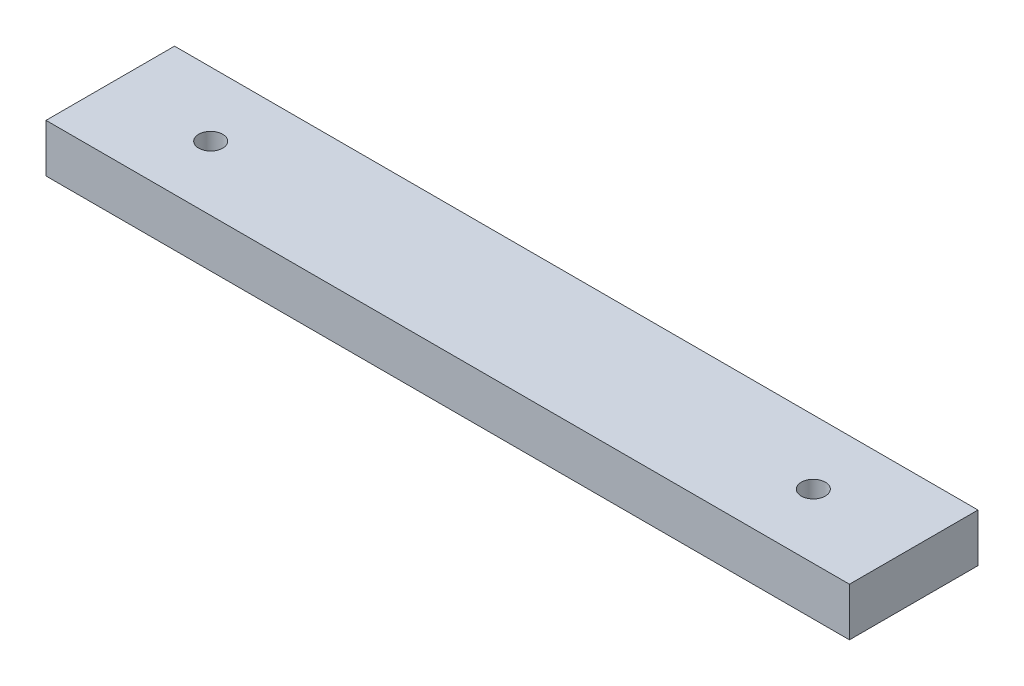
ISO-10303-21;
HEADER;
FILE_DESCRIPTION(('STEP AP214'),'2;1');
FILE_NAME('part.step','',(''),(''),'','','');
FILE_SCHEMA(('AUTOMOTIVE_DESIGN { 1 0 10303 214 1 1 1 1 }'));
ENDSEC;
DATA;
#1=APPLICATION_CONTEXT('core data for automotive mechanical design processes');
#2=APPLICATION_PROTOCOL_DEFINITION('international standard','automotive_design',2000,#1);
#3=PRODUCT_CONTEXT('',#1,'mechanical');
#4=PRODUCT('Part','Part','',(#3));
#5=PRODUCT_RELATED_PRODUCT_CATEGORY('part','',(#4));
#6=PRODUCT_DEFINITION_FORMATION('','',#4);
#7=PRODUCT_DEFINITION_CONTEXT('part definition',#1,'design');
#8=PRODUCT_DEFINITION('design','',#6,#7);
#9=PRODUCT_DEFINITION_SHAPE('','',#8);
#10=(LENGTH_UNIT() NAMED_UNIT(*) SI_UNIT(.MILLI.,.METRE.));
#11=(NAMED_UNIT(*) PLANE_ANGLE_UNIT() SI_UNIT($,.RADIAN.));
#12=(NAMED_UNIT(*) SI_UNIT($,.STERADIAN.) SOLID_ANGLE_UNIT());
#13=UNCERTAINTY_MEASURE_WITH_UNIT(LENGTH_MEASURE(1.E-05),#10,'distance_accuracy_value','');
#14=(GEOMETRIC_REPRESENTATION_CONTEXT(3) GLOBAL_UNCERTAINTY_ASSIGNED_CONTEXT((#13)) GLOBAL_UNIT_ASSIGNED_CONTEXT((#10,
#11,#12)) REPRESENTATION_CONTEXT('',''));
#15=CARTESIAN_POINT('',(0.,0.,0.));
#16=DIRECTION('',(0.,0.,1.));
#17=DIRECTION('',(1.,0.,0.));
#18=AXIS2_PLACEMENT_3D('',#15,#16,#17);
#19=CARTESIAN_POINT('',(0.,6.,0.));
#20=DIRECTION('',(0.,-1.,0.));
#21=DIRECTION('',(0.,0.,-1.));
#22=AXIS2_PLACEMENT_3D('',#19,#20,#21);
#23=PLANE('',#22);
#24=DIRECTION('',(0.,0.,1.));
#25=VECTOR('',#24,1.);
#26=CARTESIAN_POINT('',(-50.,6.,-8.));
#27=LINE('',#26,#25);
#28=CARTESIAN_POINT('',(-50.,6.,-8.));
#29=VERTEX_POINT('',#28);
#30=CARTESIAN_POINT('',(-50.,6.,8.));
#31=VERTEX_POINT('',#30);
#32=EDGE_CURVE('E85',#29,#31,#27,.T.);
#33=ORIENTED_EDGE('',*,*,#32,.T.);
#34=DIRECTION('',(1.,0.,0.));
#35=VECTOR('',#34,1.);
#36=CARTESIAN_POINT('',(50.,6.,8.));
#37=LINE('',#36,#35);
#38=CARTESIAN_POINT('',(50.,6.,8.));
#39=VERTEX_POINT('',#38);
#40=EDGE_CURVE('E80',#31,#39,#37,.T.);
#41=ORIENTED_EDGE('',*,*,#40,.T.);
#42=DIRECTION('',(0.,0.,-1.));
#43=VECTOR('',#42,1.);
#44=CARTESIAN_POINT('',(50.,6.,-8.));
#45=LINE('',#44,#43);
#46=CARTESIAN_POINT('',(50.,6.,-8.));
#47=VERTEX_POINT('',#46);
#48=EDGE_CURVE('E83',#39,#47,#45,.T.);
#49=ORIENTED_EDGE('',*,*,#48,.T.);
#50=DIRECTION('',(-1.,0.,0.));
#51=VECTOR('',#50,1.);
#52=CARTESIAN_POINT('',(50.,6.,-8.));
#53=LINE('',#52,#51);
#54=EDGE_CURVE('E50',#47,#29,#53,.T.);
#55=ORIENTED_EDGE('',*,*,#54,.T.);
#56=EDGE_LOOP('',(#33,#41,#49,#55));
#57=FACE_BOUND('',#56,.T.);
#58=CARTESIAN_POINT('',(-37.5,6.,0.));
#59=DIRECTION('',(0.,1.,0.));
#60=DIRECTION('',(0.,0.,1.));
#61=AXIS2_PLACEMENT_3D('',#58,#59,#60);
#62=CIRCLE('',#61,1.5);
#63=CARTESIAN_POINT('',(-37.5,6.,1.50000000000001));
#64=VERTEX_POINT('',#63);
#65=EDGE_CURVE('E100',#64,#64,#62,.T.);
#66=ORIENTED_EDGE('',*,*,#65,.F.);
#67=EDGE_LOOP('',(#66));
#68=FACE_BOUND('',#67,.T.);
#69=CARTESIAN_POINT('',(37.5,6.,0.));
#70=DIRECTION('',(0.,1.,0.));
#71=DIRECTION('',(0.,0.,1.));
#72=AXIS2_PLACEMENT_3D('',#69,#70,#71);
#73=CIRCLE('',#72,1.5);
#74=CARTESIAN_POINT('',(37.5,6.,1.50000000000001));
#75=VERTEX_POINT('',#74);
#76=EDGE_CURVE('E115',#75,#75,#73,.T.);
#77=ORIENTED_EDGE('',*,*,#76,.F.);
#78=EDGE_LOOP('',(#77));
#79=FACE_BOUND('',#78,.T.);
#80=ADVANCED_FACE('F33',(#57,#68,#79),#23,.F.);
#81=CARTESIAN_POINT('',(0.,0.,0.));
#82=DIRECTION('',(0.,-1.,0.));
#83=DIRECTION('',(0.,0.,-1.));
#84=AXIS2_PLACEMENT_3D('',#81,#82,#83);
#85=PLANE('',#84);
#86=CARTESIAN_POINT('',(-37.5,0.,0.));
#87=DIRECTION('',(0.,1.,0.));
#88=DIRECTION('',(0.,0.,1.));
#89=AXIS2_PLACEMENT_3D('',#86,#87,#88);
#90=CIRCLE('',#89,1.5);
#91=CARTESIAN_POINT('',(-37.5,0.,1.50000000000001));
#92=VERTEX_POINT('',#91);
#93=EDGE_CURVE('E112',#92,#92,#90,.T.);
#94=ORIENTED_EDGE('',*,*,#93,.T.);
#95=EDGE_LOOP('',(#94));
#96=FACE_BOUND('',#95,.T.);
#97=DIRECTION('',(0.,0.,1.));
#98=VECTOR('',#97,1.);
#99=CARTESIAN_POINT('',(-50.,0.,-8.));
#100=LINE('',#99,#98);
#101=CARTESIAN_POINT('',(-50.,0.,-8.));
#102=VERTEX_POINT('',#101);
#103=CARTESIAN_POINT('',(-50.,0.,8.));
#104=VERTEX_POINT('',#103);
#105=EDGE_CURVE('E97',#102,#104,#100,.T.);
#106=ORIENTED_EDGE('',*,*,#105,.F.);
#107=DIRECTION('',(-1.,0.,0.));
#108=VECTOR('',#107,1.);
#109=CARTESIAN_POINT('',(50.,0.,-8.));
#110=LINE('',#109,#108);
#111=CARTESIAN_POINT('',(50.,0.,-8.));
#112=VERTEX_POINT('',#111);
#113=EDGE_CURVE('E73',#112,#102,#110,.T.);
#114=ORIENTED_EDGE('',*,*,#113,.F.);
#115=DIRECTION('',(0.,0.,-1.));
#116=VECTOR('',#115,1.);
#117=CARTESIAN_POINT('',(50.,0.,-8.));
#118=LINE('',#117,#116);
#119=CARTESIAN_POINT('',(50.,0.,8.));
#120=VERTEX_POINT('',#119);
#121=EDGE_CURVE('E67',#120,#112,#118,.T.);
#122=ORIENTED_EDGE('',*,*,#121,.F.);
#123=DIRECTION('',(1.,0.,0.));
#124=VECTOR('',#123,1.);
#125=CARTESIAN_POINT('',(50.,0.,8.));
#126=LINE('',#125,#124);
#127=EDGE_CURVE('E89',#104,#120,#126,.T.);
#128=ORIENTED_EDGE('',*,*,#127,.F.);
#129=EDGE_LOOP('',(#106,#114,#122,#128));
#130=FACE_BOUND('',#129,.T.);
#131=CARTESIAN_POINT('',(37.5,0.,0.));
#132=DIRECTION('',(0.,1.,0.));
#133=DIRECTION('',(0.,0.,1.));
#134=AXIS2_PLACEMENT_3D('',#131,#132,#133);
#135=CIRCLE('',#134,1.5);
#136=CARTESIAN_POINT('',(37.5,0.,1.50000000000001));
#137=VERTEX_POINT('',#136);
#138=EDGE_CURVE('E118',#137,#137,#135,.T.);
#139=ORIENTED_EDGE('',*,*,#138,.T.);
#140=EDGE_LOOP('',(#139));
#141=FACE_BOUND('',#140,.T.);
#142=ADVANCED_FACE('F108',(#96,#130,#141),#85,.T.);
#143=CARTESIAN_POINT('',(-50.,6.,-8.));
#144=DIRECTION('',(1.,0.,0.));
#145=DIRECTION('',(0.,0.,-1.));
#146=AXIS2_PLACEMENT_3D('',#143,#144,#145);
#147=PLANE('',#146);
#148=ORIENTED_EDGE('',*,*,#105,.T.);
#149=DIRECTION('',(0.,-1.,0.));
#150=VECTOR('',#149,1.);
#151=CARTESIAN_POINT('',(-50.,6.,8.));
#152=LINE('',#151,#150);
#153=EDGE_CURVE('E11',#31,#104,#152,.T.);
#154=ORIENTED_EDGE('',*,*,#153,.F.);
#155=ORIENTED_EDGE('',*,*,#32,.F.);
#156=DIRECTION('',(0.,-1.,0.));
#157=VECTOR('',#156,1.);
#158=CARTESIAN_POINT('',(-50.,6.,-8.));
#159=LINE('',#158,#157);
#160=EDGE_CURVE('E93',#29,#102,#159,.T.);
#161=ORIENTED_EDGE('',*,*,#160,.T.);
#162=EDGE_LOOP('',(#148,#154,#155,#161));
#163=FACE_BOUND('',#162,.T.);
#164=ADVANCED_FACE('F35',(#163),#147,.F.);
#165=CARTESIAN_POINT('',(50.,6.,8.));
#166=DIRECTION('',(0.,0.,-1.));
#167=DIRECTION('',(-1.,0.,0.));
#168=AXIS2_PLACEMENT_3D('',#165,#166,#167);
#169=PLANE('',#168);
#170=ORIENTED_EDGE('',*,*,#127,.T.);
#171=DIRECTION('',(0.,-1.,0.));
#172=VECTOR('',#171,1.);
#173=CARTESIAN_POINT('',(50.,6.,8.));
#174=LINE('',#173,#172);
#175=EDGE_CURVE('E42',#39,#120,#174,.T.);
#176=ORIENTED_EDGE('',*,*,#175,.F.);
#177=ORIENTED_EDGE('',*,*,#40,.F.);
#178=ORIENTED_EDGE('',*,*,#153,.T.);
#179=EDGE_LOOP('',(#170,#176,#177,#178));
#180=FACE_BOUND('',#179,.T.);
#181=ADVANCED_FACE('F88',(#180),#169,.F.);
#182=CARTESIAN_POINT('',(50.,6.,-8.));
#183=DIRECTION('',(-1.,0.,0.));
#184=DIRECTION('',(0.,0.,1.));
#185=AXIS2_PLACEMENT_3D('',#182,#183,#184);
#186=PLANE('',#185);
#187=ORIENTED_EDGE('',*,*,#121,.T.);
#188=DIRECTION('',(0.,-1.,0.));
#189=VECTOR('',#188,1.);
#190=CARTESIAN_POINT('',(50.,6.,-8.));
#191=LINE('',#190,#189);
#192=EDGE_CURVE('E90',#47,#112,#191,.T.);
#193=ORIENTED_EDGE('',*,*,#192,.F.);
#194=ORIENTED_EDGE('',*,*,#48,.F.);
#195=ORIENTED_EDGE('',*,*,#175,.T.);
#196=EDGE_LOOP('',(#187,#193,#194,#195));
#197=FACE_BOUND('',#196,.T.);
#198=ADVANCED_FACE('F91',(#197),#186,.F.);
#199=CARTESIAN_POINT('',(50.,6.,-8.));
#200=DIRECTION('',(0.,0.,1.));
#201=DIRECTION('',(1.,0.,0.));
#202=AXIS2_PLACEMENT_3D('',#199,#200,#201);
#203=PLANE('',#202);
#204=ORIENTED_EDGE('',*,*,#113,.T.);
#205=ORIENTED_EDGE('',*,*,#160,.F.);
#206=ORIENTED_EDGE('',*,*,#54,.F.);
#207=ORIENTED_EDGE('',*,*,#192,.T.);
#208=EDGE_LOOP('',(#204,#205,#206,#207));
#209=FACE_BOUND('',#208,.T.);
#210=ADVANCED_FACE('F105',(#209),#203,.F.);
#211=CARTESIAN_POINT('',(-37.5,6.,0.));
#212=DIRECTION('',(0.,-1.,0.));
#213=DIRECTION('',(0.,0.,-1.));
#214=AXIS2_PLACEMENT_3D('',#211,#212,#213);
#215=CYLINDRICAL_SURFACE('',#214,1.5);
#216=ORIENTED_EDGE('',*,*,#65,.T.);
#217=EDGE_LOOP('',(#216));
#218=FACE_BOUND('',#217,.T.);
#219=ORIENTED_EDGE('',*,*,#93,.F.);
#220=EDGE_LOOP('',(#219));
#221=FACE_BOUND('',#220,.T.);
#222=ADVANCED_FACE('F135',(#218,#221),#215,.F.);
#223=CARTESIAN_POINT('',(37.5,6.,0.));
#224=DIRECTION('',(0.,-1.,0.));
#225=DIRECTION('',(0.,0.,-1.));
#226=AXIS2_PLACEMENT_3D('',#223,#224,#225);
#227=CYLINDRICAL_SURFACE('',#226,1.5);
#228=ORIENTED_EDGE('',*,*,#76,.T.);
#229=EDGE_LOOP('',(#228));
#230=FACE_BOUND('',#229,.T.);
#231=ORIENTED_EDGE('',*,*,#138,.F.);
#232=EDGE_LOOP('',(#231));
#233=FACE_BOUND('',#232,.T.);
#234=ADVANCED_FACE('F124',(#230,#233),#227,.F.);
#235=CLOSED_SHELL('',(#80,#142,#164,#181,#198,#210,#222,#234));
#236=MANIFOLD_SOLID_BREP('B2',#235);
#237=ADVANCED_BREP_SHAPE_REPRESENTATION('',(#18,#236),#14);
#238=SHAPE_DEFINITION_REPRESENTATION(#9,#237);
ENDSEC;
END-ISO-10303-21;
